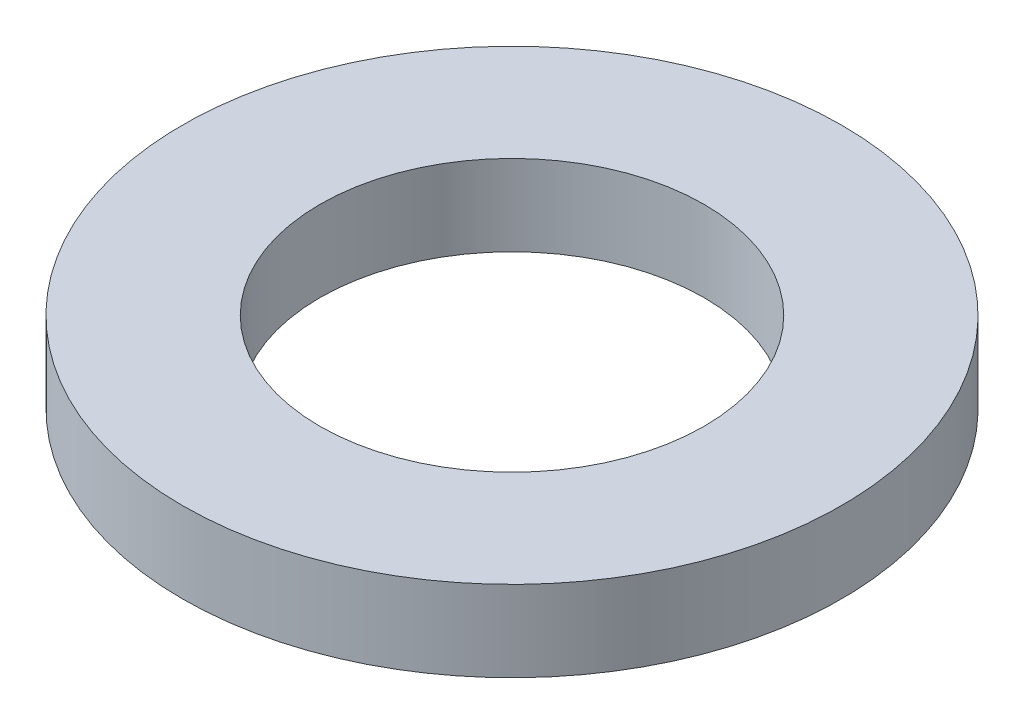
ISO-10303-21;
HEADER;
FILE_DESCRIPTION(('STEP AP214'),'2;1');
FILE_NAME('part.step','',(''),(''),'','','');
FILE_SCHEMA(('AUTOMOTIVE_DESIGN { 1 0 10303 214 1 1 1 1 }'));
ENDSEC;
DATA;
#1=APPLICATION_CONTEXT('core data for automotive mechanical design processes');
#2=APPLICATION_PROTOCOL_DEFINITION('international standard','automotive_design',2000,#1);
#3=PRODUCT_CONTEXT('',#1,'mechanical');
#4=PRODUCT('Part','Part','',(#3));
#5=PRODUCT_RELATED_PRODUCT_CATEGORY('part','',(#4));
#6=PRODUCT_DEFINITION_FORMATION('','',#4);
#7=PRODUCT_DEFINITION_CONTEXT('part definition',#1,'design');
#8=PRODUCT_DEFINITION('design','',#6,#7);
#9=PRODUCT_DEFINITION_SHAPE('','',#8);
#10=(LENGTH_UNIT() NAMED_UNIT(*) SI_UNIT(.MILLI.,.METRE.));
#11=(NAMED_UNIT(*) PLANE_ANGLE_UNIT() SI_UNIT($,.RADIAN.));
#12=(NAMED_UNIT(*) SI_UNIT($,.STERADIAN.) SOLID_ANGLE_UNIT());
#13=UNCERTAINTY_MEASURE_WITH_UNIT(LENGTH_MEASURE(1.E-05),#10,'distance_accuracy_value','');
#14=(GEOMETRIC_REPRESENTATION_CONTEXT(3) GLOBAL_UNCERTAINTY_ASSIGNED_CONTEXT((#13)) GLOBAL_UNIT_ASSIGNED_CONTEXT((#10,
#11,#12)) REPRESENTATION_CONTEXT('',''));
#15=CARTESIAN_POINT('',(0.,0.,0.));
#16=DIRECTION('',(0.,0.,1.));
#17=DIRECTION('',(1.,0.,0.));
#18=AXIS2_PLACEMENT_3D('',#15,#16,#17);
#19=CARTESIAN_POINT('',(0.,1.7526,0.));
#20=DIRECTION('',(0.,-1.,0.));
#21=DIRECTION('',(0.,0.,-1.));
#22=AXIS2_PLACEMENT_3D('',#19,#20,#21);
#23=CYLINDRICAL_SURFACE('',#22,7.14375);
#24=CARTESIAN_POINT('',(0.,1.7526,0.));
#25=DIRECTION('',(0.,1.,0.));
#26=DIRECTION('',(0.,0.,1.));
#27=AXIS2_PLACEMENT_3D('',#24,#25,#26);
#28=CIRCLE('',#27,7.14375);
#29=CARTESIAN_POINT('',(0.,1.7526,7.14375));
#30=VERTEX_POINT('',#29);
#31=EDGE_CURVE('E10',#30,#30,#28,.T.);
#32=ORIENTED_EDGE('',*,*,#31,.F.);
#33=EDGE_LOOP('',(#32));
#34=FACE_BOUND('',#33,.T.);
#35=CARTESIAN_POINT('',(0.,0.,0.));
#36=DIRECTION('',(0.,1.,0.));
#37=DIRECTION('',(0.,0.,1.));
#38=AXIS2_PLACEMENT_3D('',#35,#36,#37);
#39=CIRCLE('',#38,7.14375);
#40=CARTESIAN_POINT('',(0.,0.,7.14375));
#41=VERTEX_POINT('',#40);
#42=EDGE_CURVE('E33',#41,#41,#39,.T.);
#43=ORIENTED_EDGE('',*,*,#42,.T.);
#44=EDGE_LOOP('',(#43));
#45=FACE_BOUND('',#44,.T.);
#46=ADVANCED_FACE('F30',(#34,#45),#23,.T.);
#47=CARTESIAN_POINT('',(0.,1.7526,0.));
#48=DIRECTION('',(0.,1.,0.));
#49=DIRECTION('',(0.,0.,1.));
#50=AXIS2_PLACEMENT_3D('',#47,#48,#49);
#51=PLANE('',#50);
#52=CARTESIAN_POINT('',(0.,1.7526,0.));
#53=DIRECTION('',(0.,1.,0.));
#54=DIRECTION('',(0.,0.,1.));
#55=AXIS2_PLACEMENT_3D('',#52,#53,#54);
#56=CIRCLE('',#55,4.1656);
#57=CARTESIAN_POINT('',(0.,1.7526,4.1656));
#58=VERTEX_POINT('',#57);
#59=EDGE_CURVE('E42',#58,#58,#56,.T.);
#60=ORIENTED_EDGE('',*,*,#59,.F.);
#61=EDGE_LOOP('',(#60));
#62=FACE_BOUND('',#61,.T.);
#63=ORIENTED_EDGE('',*,*,#31,.T.);
#64=EDGE_LOOP('',(#63));
#65=FACE_BOUND('',#64,.T.);
#66=ADVANCED_FACE('F57',(#62,#65),#51,.T.);
#67=CARTESIAN_POINT('',(0.,0.,0.));
#68=DIRECTION('',(0.,1.,0.));
#69=DIRECTION('',(0.,0.,1.));
#70=AXIS2_PLACEMENT_3D('',#67,#68,#69);
#71=PLANE('',#70);
#72=CARTESIAN_POINT('',(0.,0.,0.));
#73=DIRECTION('',(0.,1.,0.));
#74=DIRECTION('',(0.,0.,1.));
#75=AXIS2_PLACEMENT_3D('',#72,#73,#74);
#76=CIRCLE('',#75,4.1656);
#77=CARTESIAN_POINT('',(0.,0.,4.1656));
#78=VERTEX_POINT('',#77);
#79=EDGE_CURVE('E40',#78,#78,#76,.T.);
#80=ORIENTED_EDGE('',*,*,#79,.T.);
#81=EDGE_LOOP('',(#80));
#82=FACE_BOUND('',#81,.T.);
#83=ORIENTED_EDGE('',*,*,#42,.F.);
#84=EDGE_LOOP('',(#83));
#85=FACE_BOUND('',#84,.T.);
#86=ADVANCED_FACE('F48',(#82,#85),#71,.F.);
#87=CARTESIAN_POINT('',(0.,0.,0.));
#88=DIRECTION('',(0.,1.,0.));
#89=DIRECTION('',(0.,0.,1.));
#90=AXIS2_PLACEMENT_3D('',#87,#88,#89);
#91=CYLINDRICAL_SURFACE('',#90,4.1656);
#92=ORIENTED_EDGE('',*,*,#79,.F.);
#93=EDGE_LOOP('',(#92));
#94=FACE_BOUND('',#93,.T.);
#95=ORIENTED_EDGE('',*,*,#59,.T.);
#96=EDGE_LOOP('',(#95));
#97=FACE_BOUND('',#96,.T.);
#98=ADVANCED_FACE('F51',(#94,#97),#91,.F.);
#99=CLOSED_SHELL('',(#46,#66,#86,#98));
#100=MANIFOLD_SOLID_BREP('B2',#99);
#101=ADVANCED_BREP_SHAPE_REPRESENTATION('',(#18,#100),#14);
#102=SHAPE_DEFINITION_REPRESENTATION(#9,#101);
ENDSEC;
END-ISO-10303-21;
